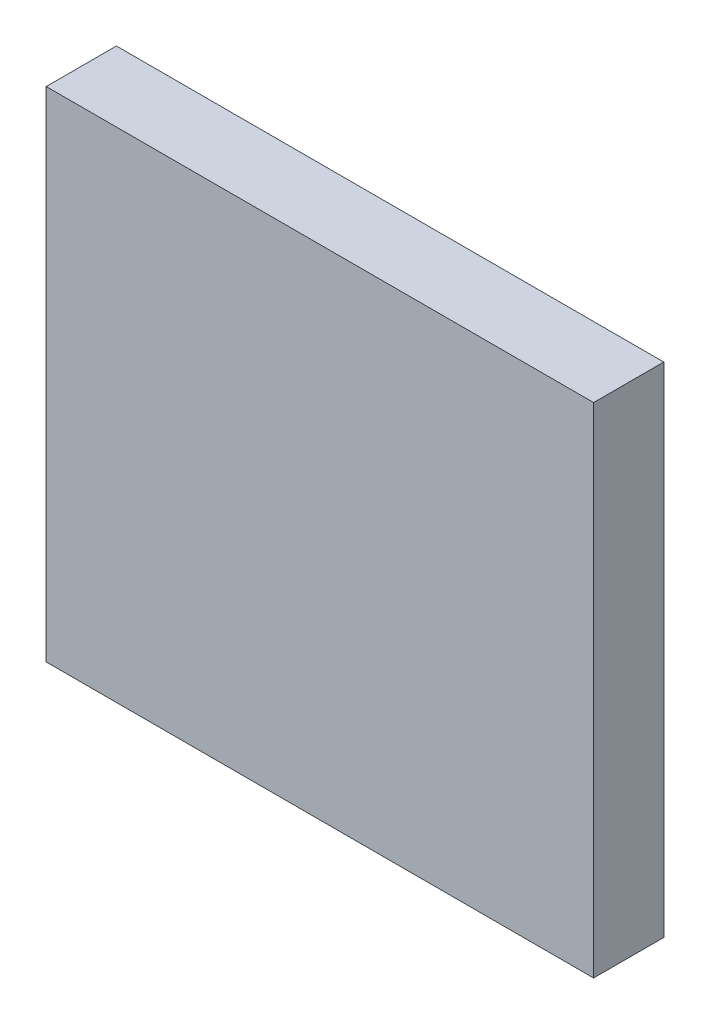
ISO-10303-21;
HEADER;
FILE_DESCRIPTION(('STEP AP214'),'2;1');
FILE_NAME('part.step','',(''),(''),'','','');
FILE_SCHEMA(('AUTOMOTIVE_DESIGN { 1 0 10303 214 1 1 1 1 }'));
ENDSEC;
DATA;
#1=APPLICATION_CONTEXT('core data for automotive mechanical design processes');
#2=APPLICATION_PROTOCOL_DEFINITION('international standard','automotive_design',2000,#1);
#3=PRODUCT_CONTEXT('',#1,'mechanical');
#4=PRODUCT('Part','Part','',(#3));
#5=PRODUCT_RELATED_PRODUCT_CATEGORY('part','',(#4));
#6=PRODUCT_DEFINITION_FORMATION('','',#4);
#7=PRODUCT_DEFINITION_CONTEXT('part definition',#1,'design');
#8=PRODUCT_DEFINITION('design','',#6,#7);
#9=PRODUCT_DEFINITION_SHAPE('','',#8);
#10=(LENGTH_UNIT() NAMED_UNIT(*) SI_UNIT(.MILLI.,.METRE.));
#11=(NAMED_UNIT(*) PLANE_ANGLE_UNIT() SI_UNIT($,.RADIAN.));
#12=(NAMED_UNIT(*) SI_UNIT($,.STERADIAN.) SOLID_ANGLE_UNIT());
#13=UNCERTAINTY_MEASURE_WITH_UNIT(LENGTH_MEASURE(1.E-05),#10,'distance_accuracy_value','');
#14=(GEOMETRIC_REPRESENTATION_CONTEXT(3) GLOBAL_UNCERTAINTY_ASSIGNED_CONTEXT((#13)) GLOBAL_UNIT_ASSIGNED_CONTEXT((#10,
#11,#12)) REPRESENTATION_CONTEXT('',''));
#15=CARTESIAN_POINT('',(0.,0.,0.));
#16=DIRECTION('',(0.,0.,1.));
#17=DIRECTION('',(1.,0.,0.));
#18=AXIS2_PLACEMENT_3D('',#15,#16,#17);
#19=CARTESIAN_POINT('',(-2.15,-3.6,1.));
#20=DIRECTION('',(1.,0.,0.));
#21=DIRECTION('',(0.,0.,-1.));
#22=AXIS2_PLACEMENT_3D('',#19,#20,#21);
#23=PLANE('',#22);
#24=DIRECTION('',(0.,-1.,0.));
#25=VECTOR('',#24,1.);
#26=CARTESIAN_POINT('',(-2.15,-3.6,0.));
#27=LINE('',#26,#25);
#28=CARTESIAN_POINT('',(-2.15,3.5016,0.));
#29=VERTEX_POINT('',#28);
#30=CARTESIAN_POINT('',(-2.15,-3.6,0.));
#31=VERTEX_POINT('',#30);
#32=EDGE_CURVE('E96',#29,#31,#27,.T.);
#33=ORIENTED_EDGE('',*,*,#32,.T.);
#34=DIRECTION('',(0.,0.,-1.));
#35=VECTOR('',#34,1.);
#36=CARTESIAN_POINT('',(-2.15,-3.6,1.));
#37=LINE('',#36,#35);
#38=CARTESIAN_POINT('',(-2.15,-3.6,1.));
#39=VERTEX_POINT('',#38);
#40=EDGE_CURVE('E11',#39,#31,#37,.T.);
#41=ORIENTED_EDGE('',*,*,#40,.F.);
#42=DIRECTION('',(0.,-1.,0.));
#43=VECTOR('',#42,1.);
#44=CARTESIAN_POINT('',(-2.15,-3.6,1.));
#45=LINE('',#44,#43);
#46=CARTESIAN_POINT('',(-2.15,3.5016,1.));
#47=VERTEX_POINT('',#46);
#48=EDGE_CURVE('E84',#47,#39,#45,.T.);
#49=ORIENTED_EDGE('',*,*,#48,.F.);
#50=DIRECTION('',(0.,0.,-1.));
#51=VECTOR('',#50,1.);
#52=CARTESIAN_POINT('',(-2.15,3.5016,1.));
#53=LINE('',#52,#51);
#54=EDGE_CURVE('E92',#47,#29,#53,.T.);
#55=ORIENTED_EDGE('',*,*,#54,.T.);
#56=EDGE_LOOP('',(#33,#41,#49,#55));
#57=FACE_BOUND('',#56,.T.);
#58=ADVANCED_FACE('F33',(#57),#23,.F.);
#59=CARTESIAN_POINT('',(5.65,-3.6,1.));
#60=DIRECTION('',(0.,1.,0.));
#61=DIRECTION('',(0.,0.,1.));
#62=AXIS2_PLACEMENT_3D('',#59,#60,#61);
#63=PLANE('',#62);
#64=DIRECTION('',(1.,0.,0.));
#65=VECTOR('',#64,1.);
#66=CARTESIAN_POINT('',(5.65,-3.6,0.));
#67=LINE('',#66,#65);
#68=CARTESIAN_POINT('',(5.65,-3.6,0.));
#69=VERTEX_POINT('',#68);
#70=EDGE_CURVE('E88',#31,#69,#67,.T.);
#71=ORIENTED_EDGE('',*,*,#70,.T.);
#72=DIRECTION('',(0.,0.,-1.));
#73=VECTOR('',#72,1.);
#74=CARTESIAN_POINT('',(5.65,-3.6,1.));
#75=LINE('',#74,#73);
#76=CARTESIAN_POINT('',(5.65,-3.6,1.));
#77=VERTEX_POINT('',#76);
#78=EDGE_CURVE('E41',#77,#69,#75,.T.);
#79=ORIENTED_EDGE('',*,*,#78,.F.);
#80=DIRECTION('',(1.,0.,0.));
#81=VECTOR('',#80,1.);
#82=CARTESIAN_POINT('',(5.65,-3.6,1.));
#83=LINE('',#82,#81);
#84=EDGE_CURVE('E79',#39,#77,#83,.T.);
#85=ORIENTED_EDGE('',*,*,#84,.F.);
#86=ORIENTED_EDGE('',*,*,#40,.T.);
#87=EDGE_LOOP('',(#71,#79,#85,#86));
#88=FACE_BOUND('',#87,.T.);
#89=ADVANCED_FACE('F87',(#88),#63,.F.);
#90=CARTESIAN_POINT('',(5.65,3.5016,1.));
#91=DIRECTION('',(-1.,0.,0.));
#92=DIRECTION('',(0.,0.,1.));
#93=AXIS2_PLACEMENT_3D('',#90,#91,#92);
#94=PLANE('',#93);
#95=DIRECTION('',(0.,1.,0.));
#96=VECTOR('',#95,1.);
#97=CARTESIAN_POINT('',(5.65,3.5016,0.));
#98=LINE('',#97,#96);
#99=CARTESIAN_POINT('',(5.65,3.5016,0.));
#100=VERTEX_POINT('',#99);
#101=EDGE_CURVE('E66',#69,#100,#98,.T.);
#102=ORIENTED_EDGE('',*,*,#101,.T.);
#103=DIRECTION('',(0.,0.,-1.));
#104=VECTOR('',#103,1.);
#105=CARTESIAN_POINT('',(5.65,3.5016,1.));
#106=LINE('',#105,#104);
#107=CARTESIAN_POINT('',(5.65,3.5016,1.));
#108=VERTEX_POINT('',#107);
#109=EDGE_CURVE('E89',#108,#100,#106,.T.);
#110=ORIENTED_EDGE('',*,*,#109,.F.);
#111=DIRECTION('',(0.,1.,0.));
#112=VECTOR('',#111,1.);
#113=CARTESIAN_POINT('',(5.65,3.5016,1.));
#114=LINE('',#113,#112);
#115=EDGE_CURVE('E82',#77,#108,#114,.T.);
#116=ORIENTED_EDGE('',*,*,#115,.F.);
#117=ORIENTED_EDGE('',*,*,#78,.T.);
#118=EDGE_LOOP('',(#102,#110,#116,#117));
#119=FACE_BOUND('',#118,.T.);
#120=ADVANCED_FACE('F90',(#119),#94,.F.);
#121=CARTESIAN_POINT('',(-2.15,3.5016,1.));
#122=DIRECTION('',(0.,-1.,0.));
#123=DIRECTION('',(0.,0.,-1.));
#124=AXIS2_PLACEMENT_3D('',#121,#122,#123);
#125=PLANE('',#124);
#126=DIRECTION('',(-1.,0.,0.));
#127=VECTOR('',#126,1.);
#128=CARTESIAN_POINT('',(-2.15,3.5016,0.));
#129=LINE('',#128,#127);
#130=EDGE_CURVE('E72',#100,#29,#129,.T.);
#131=ORIENTED_EDGE('',*,*,#130,.T.);
#132=ORIENTED_EDGE('',*,*,#54,.F.);
#133=DIRECTION('',(-1.,0.,0.));
#134=VECTOR('',#133,1.);
#135=CARTESIAN_POINT('',(-2.15,3.5016,1.));
#136=LINE('',#135,#134);
#137=EDGE_CURVE('E49',#108,#47,#136,.T.);
#138=ORIENTED_EDGE('',*,*,#137,.F.);
#139=ORIENTED_EDGE('',*,*,#109,.T.);
#140=EDGE_LOOP('',(#131,#132,#138,#139));
#141=FACE_BOUND('',#140,.T.);
#142=ADVANCED_FACE('F103',(#141),#125,.F.);
#143=CARTESIAN_POINT('',(0.,0.,1.));
#144=DIRECTION('',(0.,0.,-1.));
#145=DIRECTION('',(-1.,0.,0.));
#146=AXIS2_PLACEMENT_3D('',#143,#144,#145);
#147=PLANE('',#146);
#148=ORIENTED_EDGE('',*,*,#48,.T.);
#149=ORIENTED_EDGE('',*,*,#84,.T.);
#150=ORIENTED_EDGE('',*,*,#115,.T.);
#151=ORIENTED_EDGE('',*,*,#137,.T.);
#152=EDGE_LOOP('',(#148,#149,#150,#151));
#153=FACE_BOUND('',#152,.T.);
#154=ADVANCED_FACE('F80',(#153),#147,.F.);
#155=CARTESIAN_POINT('',(0.,0.,0.));
#156=DIRECTION('',(0.,0.,-1.));
#157=DIRECTION('',(-1.,0.,0.));
#158=AXIS2_PLACEMENT_3D('',#155,#156,#157);
#159=PLANE('',#158);
#160=ORIENTED_EDGE('',*,*,#32,.F.);
#161=ORIENTED_EDGE('',*,*,#130,.F.);
#162=ORIENTED_EDGE('',*,*,#101,.F.);
#163=ORIENTED_EDGE('',*,*,#70,.F.);
#164=EDGE_LOOP('',(#160,#161,#162,#163));
#165=FACE_BOUND('',#164,.T.);
#166=ADVANCED_FACE('F106',(#165),#159,.T.);
#167=CLOSED_SHELL('',(#58,#89,#120,#142,#154,#166));
#168=MANIFOLD_SOLID_BREP('B2',#167);
#169=ADVANCED_BREP_SHAPE_REPRESENTATION('',(#18,#168),#14);
#170=SHAPE_DEFINITION_REPRESENTATION(#9,#169);
ENDSEC;
END-ISO-10303-21;
